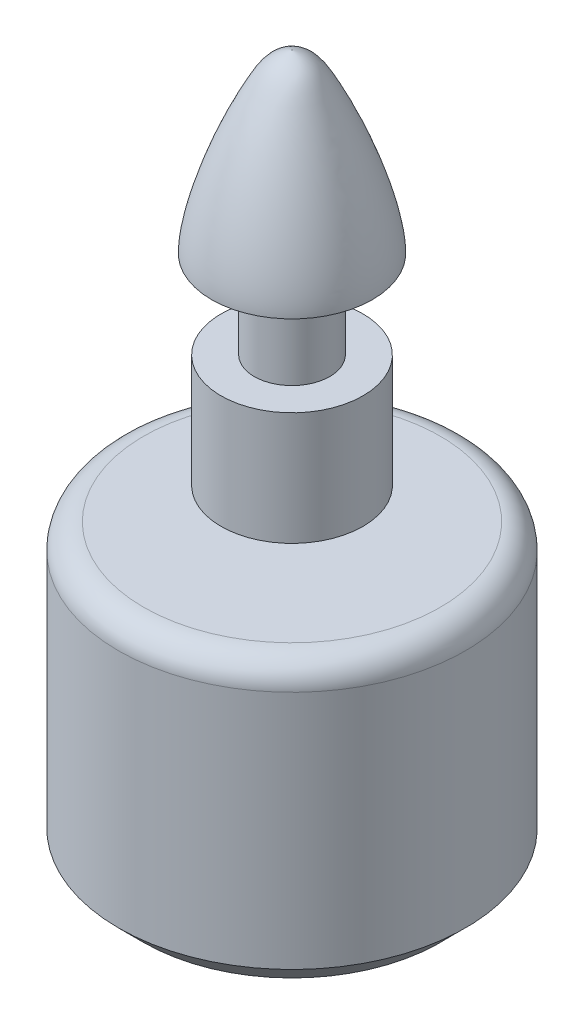
ISO-10303-21;
HEADER;
FILE_DESCRIPTION(('STEP AP214'),'2;1');
FILE_NAME('part.step','',(''),(''),'','','');
FILE_SCHEMA(('AUTOMOTIVE_DESIGN { 1 0 10303 214 1 1 1 1 }'));
ENDSEC;
DATA;
#1=APPLICATION_CONTEXT('core data for automotive mechanical design processes');
#2=APPLICATION_PROTOCOL_DEFINITION('international standard','automotive_design',2000,#1);
#3=PRODUCT_CONTEXT('',#1,'mechanical');
#4=PRODUCT('Part','Part','',(#3));
#5=PRODUCT_RELATED_PRODUCT_CATEGORY('part','',(#4));
#6=PRODUCT_DEFINITION_FORMATION('','',#4);
#7=PRODUCT_DEFINITION_CONTEXT('part definition',#1,'design');
#8=PRODUCT_DEFINITION('design','',#6,#7);
#9=PRODUCT_DEFINITION_SHAPE('','',#8);
#10=(LENGTH_UNIT() NAMED_UNIT(*) SI_UNIT(.MILLI.,.METRE.));
#11=(NAMED_UNIT(*) PLANE_ANGLE_UNIT() SI_UNIT($,.RADIAN.));
#12=(NAMED_UNIT(*) SI_UNIT($,.STERADIAN.) SOLID_ANGLE_UNIT());
#13=UNCERTAINTY_MEASURE_WITH_UNIT(LENGTH_MEASURE(1.E-05),#10,'distance_accuracy_value','');
#14=(GEOMETRIC_REPRESENTATION_CONTEXT(3) GLOBAL_UNCERTAINTY_ASSIGNED_CONTEXT((#13)) GLOBAL_UNIT_ASSIGNED_CONTEXT((#10,
#11,#12)) REPRESENTATION_CONTEXT('',''));
#15=CARTESIAN_POINT('',(0.,0.,0.));
#16=DIRECTION('',(0.,0.,1.));
#17=DIRECTION('',(1.,0.,0.));
#18=AXIS2_PLACEMENT_3D('',#15,#16,#17);
#19=CARTESIAN_POINT('',(0.,0.,0.));
#20=DIRECTION('',(0.,1.,0.));
#21=DIRECTION('',(0.,0.,1.));
#22=AXIS2_PLACEMENT_3D('',#19,#20,#21);
#23=PLANE('',#22);
#24=CARTESIAN_POINT('',(0.,0.,0.));
#25=DIRECTION('',(0.,1.,0.));
#26=DIRECTION('',(0.,0.,1.));
#27=AXIS2_PLACEMENT_3D('',#24,#25,#26);
#28=CIRCLE('',#27,11.8);
#29=CARTESIAN_POINT('',(0.,0.,11.8));
#30=VERTEX_POINT('',#29);
#31=EDGE_CURVE('E11',#30,#30,#28,.F.);
#32=ORIENTED_EDGE('',*,*,#31,.T.);
#33=EDGE_LOOP('',(#32));
#34=FACE_BOUND('',#33,.T.);
#35=CARTESIAN_POINT('',(0.,0.,-9.5));
#36=DIRECTION('',(0.,1.,0.));
#37=DIRECTION('',(0.,0.,1.));
#38=AXIS2_PLACEMENT_3D('',#35,#36,#37);
#39=CIRCLE('',#38,1.25);
#40=CARTESIAN_POINT('',(0.,0.,-8.25));
#41=VERTEX_POINT('',#40);
#42=EDGE_CURVE('E99',#41,#41,#39,.T.);
#43=ORIENTED_EDGE('',*,*,#42,.T.);
#44=EDGE_LOOP('',(#43));
#45=FACE_BOUND('',#44,.T.);
#46=CARTESIAN_POINT('',(0.,0.,9.5));
#47=DIRECTION('',(0.,1.,0.));
#48=DIRECTION('',(0.,0.,1.));
#49=AXIS2_PLACEMENT_3D('',#46,#47,#48);
#50=CIRCLE('',#49,1.25);
#51=CARTESIAN_POINT('',(0.,0.,10.75));
#52=VERTEX_POINT('',#51);
#53=EDGE_CURVE('E103',#52,#52,#50,.T.);
#54=ORIENTED_EDGE('',*,*,#53,.T.);
#55=EDGE_LOOP('',(#54));
#56=FACE_BOUND('',#55,.T.);
#57=CARTESIAN_POINT('',(8.,0.,0.));
#58=DIRECTION('',(0.,1.,0.));
#59=DIRECTION('',(0.,0.,1.));
#60=AXIS2_PLACEMENT_3D('',#57,#58,#59);
#61=CIRCLE('',#60,1.25);
#62=CARTESIAN_POINT('',(8.,0.,1.25));
#63=VERTEX_POINT('',#62);
#64=EDGE_CURVE('E117',#63,#63,#61,.T.);
#65=ORIENTED_EDGE('',*,*,#64,.T.);
#66=EDGE_LOOP('',(#65));
#67=FACE_BOUND('',#66,.T.);
#68=CARTESIAN_POINT('',(-8.,0.,0.));
#69=DIRECTION('',(0.,1.,0.));
#70=DIRECTION('',(0.,0.,1.));
#71=AXIS2_PLACEMENT_3D('',#68,#69,#70);
#72=CIRCLE('',#71,1.25);
#73=CARTESIAN_POINT('',(-8.,0.,1.25));
#74=VERTEX_POINT('',#73);
#75=EDGE_CURVE('E123',#74,#74,#72,.T.);
#76=ORIENTED_EDGE('',*,*,#75,.T.);
#77=EDGE_LOOP('',(#76));
#78=FACE_BOUND('',#77,.T.);
#79=ADVANCED_FACE('F38',(#34,#45,#56,#67,#78),#23,.F.);
#80=CARTESIAN_POINT('',(0.,4.6,0.));
#81=DIRECTION('',(0.,-1.,0.));
#82=DIRECTION('',(0.,0.,-1.));
#83=AXIS2_PLACEMENT_3D('',#80,#81,#82);
#84=CYLINDRICAL_SURFACE('',#83,13.8);
#85=CARTESIAN_POINT('',(0.,2.,0.));
#86=DIRECTION('',(0.,1.,0.));
#87=DIRECTION('',(0.,0.,1.));
#88=AXIS2_PLACEMENT_3D('',#85,#86,#87);
#89=CIRCLE('',#88,13.8);
#90=CARTESIAN_POINT('',(0.,2.,13.8));
#91=VERTEX_POINT('',#90);
#92=EDGE_CURVE('E45',#91,#91,#89,.T.);
#93=ORIENTED_EDGE('',*,*,#92,.T.);
#94=EDGE_LOOP('',(#93));
#95=FACE_BOUND('',#94,.T.);
#96=CARTESIAN_POINT('',(0.,21.1,0.));
#97=DIRECTION('',(0.,1.,0.));
#98=DIRECTION('',(0.,0.,1.));
#99=AXIS2_PLACEMENT_3D('',#96,#97,#98);
#100=CIRCLE('',#99,13.8);
#101=CARTESIAN_POINT('',(0.,21.1,13.8));
#102=VERTEX_POINT('',#101);
#103=EDGE_CURVE('E94',#102,#102,#100,.F.);
#104=ORIENTED_EDGE('',*,*,#103,.T.);
#105=EDGE_LOOP('',(#104));
#106=FACE_BOUND('',#105,.T.);
#107=ADVANCED_FACE('F64',(#95,#106),#84,.T.);
#108=CARTESIAN_POINT('',(0.,4.6,-9.5));
#109=DIRECTION('',(0.,-1.,0.));
#110=DIRECTION('',(0.,0.,-1.));
#111=AXIS2_PLACEMENT_3D('',#108,#109,#110);
#112=CYLINDRICAL_SURFACE('',#111,1.25);
#113=CARTESIAN_POINT('',(0.,4.6,-9.5));
#114=DIRECTION('',(0.,1.,0.));
#115=DIRECTION('',(0.,0.,1.));
#116=AXIS2_PLACEMENT_3D('',#113,#114,#115);
#117=CIRCLE('',#116,1.25);
#118=CARTESIAN_POINT('',(0.,4.6,-8.25));
#119=VERTEX_POINT('',#118);
#120=EDGE_CURVE('E110',#119,#119,#117,.T.);
#121=ORIENTED_EDGE('',*,*,#120,.T.);
#122=EDGE_LOOP('',(#121));
#123=FACE_BOUND('',#122,.T.);
#124=ORIENTED_EDGE('',*,*,#42,.F.);
#125=EDGE_LOOP('',(#124));
#126=FACE_BOUND('',#125,.T.);
#127=ADVANCED_FACE('F70',(#123,#126),#112,.F.);
#128=CARTESIAN_POINT('',(0.,4.6,9.5));
#129=DIRECTION('',(0.,-1.,0.));
#130=DIRECTION('',(0.,0.,-1.));
#131=AXIS2_PLACEMENT_3D('',#128,#129,#130);
#132=CYLINDRICAL_SURFACE('',#131,1.25);
#133=CARTESIAN_POINT('',(0.,4.6,9.5));
#134=DIRECTION('',(0.,1.,0.));
#135=DIRECTION('',(0.,0.,1.));
#136=AXIS2_PLACEMENT_3D('',#133,#134,#135);
#137=CIRCLE('',#136,1.25);
#138=CARTESIAN_POINT('',(0.,4.6,10.75));
#139=VERTEX_POINT('',#138);
#140=EDGE_CURVE('E114',#139,#139,#137,.T.);
#141=ORIENTED_EDGE('',*,*,#140,.T.);
#142=EDGE_LOOP('',(#141));
#143=FACE_BOUND('',#142,.T.);
#144=ORIENTED_EDGE('',*,*,#53,.F.);
#145=EDGE_LOOP('',(#144));
#146=FACE_BOUND('',#145,.T.);
#147=ADVANCED_FACE('F188',(#143,#146),#132,.F.);
#148=CARTESIAN_POINT('',(8.,4.6,0.));
#149=DIRECTION('',(0.,-1.,0.));
#150=DIRECTION('',(0.,0.,-1.));
#151=AXIS2_PLACEMENT_3D('',#148,#149,#150);
#152=CYLINDRICAL_SURFACE('',#151,1.25);
#153=CARTESIAN_POINT('',(8.,4.6,0.));
#154=DIRECTION('',(0.,1.,0.));
#155=DIRECTION('',(0.,0.,1.));
#156=AXIS2_PLACEMENT_3D('',#153,#154,#155);
#157=CIRCLE('',#156,1.25);
#158=CARTESIAN_POINT('',(8.,4.6,1.25));
#159=VERTEX_POINT('',#158);
#160=EDGE_CURVE('E113',#159,#159,#157,.T.);
#161=ORIENTED_EDGE('',*,*,#160,.T.);
#162=EDGE_LOOP('',(#161));
#163=FACE_BOUND('',#162,.T.);
#164=ORIENTED_EDGE('',*,*,#64,.F.);
#165=EDGE_LOOP('',(#164));
#166=FACE_BOUND('',#165,.T.);
#167=ADVANCED_FACE('F185',(#163,#166),#152,.F.);
#168=CARTESIAN_POINT('',(-8.,4.6,0.));
#169=DIRECTION('',(0.,-1.,0.));
#170=DIRECTION('',(0.,0.,-1.));
#171=AXIS2_PLACEMENT_3D('',#168,#169,#170);
#172=CYLINDRICAL_SURFACE('',#171,1.25);
#173=CARTESIAN_POINT('',(-8.,4.6,0.));
#174=DIRECTION('',(0.,1.,0.));
#175=DIRECTION('',(0.,0.,1.));
#176=AXIS2_PLACEMENT_3D('',#173,#174,#175);
#177=CIRCLE('',#176,1.25);
#178=CARTESIAN_POINT('',(-8.,4.6,1.25));
#179=VERTEX_POINT('',#178);
#180=EDGE_CURVE('E120',#179,#179,#177,.T.);
#181=ORIENTED_EDGE('',*,*,#180,.T.);
#182=EDGE_LOOP('',(#181));
#183=FACE_BOUND('',#182,.T.);
#184=ORIENTED_EDGE('',*,*,#75,.F.);
#185=EDGE_LOOP('',(#184));
#186=FACE_BOUND('',#185,.T.);
#187=ADVANCED_FACE('F182',(#183,#186),#172,.F.);
#188=CARTESIAN_POINT('',(0.,4.6,0.));
#189=DIRECTION('',(0.,1.,0.));
#190=DIRECTION('',(0.,0.,1.));
#191=AXIS2_PLACEMENT_3D('',#188,#189,#190);
#192=PLANE('',#191);
#193=ORIENTED_EDGE('',*,*,#180,.F.);
#194=EDGE_LOOP('',(#193));
#195=FACE_BOUND('',#194,.T.);
#196=ADVANCED_FACE('F181',(#195),#192,.F.);
#197=ORIENTED_EDGE('',*,*,#140,.F.);
#198=EDGE_LOOP('',(#197));
#199=FACE_BOUND('',#198,.T.);
#200=ADVANCED_FACE('F207',(#199),#192,.F.);
#201=ORIENTED_EDGE('',*,*,#120,.F.);
#202=EDGE_LOOP('',(#201));
#203=FACE_BOUND('',#202,.T.);
#204=ADVANCED_FACE('F179',(#203),#192,.F.);
#205=ORIENTED_EDGE('',*,*,#160,.F.);
#206=EDGE_LOOP('',(#205));
#207=FACE_BOUND('',#206,.T.);
#208=ADVANCED_FACE('F88',(#207),#192,.F.);
#209=CARTESIAN_POINT('',(0.,23.1,0.));
#210=DIRECTION('',(0.,1.,0.));
#211=DIRECTION('',(0.,0.,1.));
#212=AXIS2_PLACEMENT_3D('',#209,#210,#211);
#213=PLANE('',#212);
#214=CARTESIAN_POINT('',(0.,23.1,0.));
#215=DIRECTION('',(0.,-1.,0.));
#216=DIRECTION('',(1.,0.,0.));
#217=AXIS2_PLACEMENT_3D('',#214,#215,#216);
#218=CIRCLE('',#217,1.5);
#219=CARTESIAN_POINT('',(1.5,23.1,0.));
#220=VERTEX_POINT('',#219);
#221=EDGE_CURVE('E130',#220,#220,#218,.T.);
#222=ORIENTED_EDGE('',*,*,#221,.T.);
#223=EDGE_LOOP('',(#222));
#224=FACE_BOUND('',#223,.T.);
#225=CARTESIAN_POINT('',(0.,23.1,0.));
#226=DIRECTION('',(0.,1.,0.));
#227=DIRECTION('',(0.,0.,1.));
#228=AXIS2_PLACEMENT_3D('',#225,#226,#227);
#229=CIRCLE('',#228,11.8);
#230=CARTESIAN_POINT('',(0.,23.1,11.8));
#231=VERTEX_POINT('',#230);
#232=EDGE_CURVE('E97',#231,#231,#229,.T.);
#233=ORIENTED_EDGE('',*,*,#232,.T.);
#234=EDGE_LOOP('',(#233));
#235=FACE_BOUND('',#234,.T.);
#236=ADVANCED_FACE('F79',(#224,#235),#213,.T.);
#237=CARTESIAN_POINT('',(0.,21.1,0.));
#238=DIRECTION('',(0.,1.,0.));
#239=DIRECTION('',(0.,0.,1.));
#240=AXIS2_PLACEMENT_3D('',#237,#238,#239);
#241=TOROIDAL_SURFACE('',#240,11.8,2.);
#242=ORIENTED_EDGE('',*,*,#103,.F.);
#243=EDGE_LOOP('',(#242));
#244=FACE_BOUND('',#243,.T.);
#245=ORIENTED_EDGE('',*,*,#232,.F.);
#246=EDGE_LOOP('',(#245));
#247=FACE_BOUND('',#246,.T.);
#248=ADVANCED_FACE('F76',(#244,#247),#241,.T.);
#249=CARTESIAN_POINT('',(0.,23.1,0.));
#250=DIRECTION('',(0.,-1.,0.));
#251=DIRECTION('',(1.,0.,0.));
#252=AXIS2_PLACEMENT_3D('',#249,#250,#251);
#253=CYLINDRICAL_SURFACE('',#252,1.5);
#254=ORIENTED_EDGE('',*,*,#221,.F.);
#255=EDGE_LOOP('',(#254));
#256=FACE_BOUND('',#255,.T.);
#257=CARTESIAN_POINT('',(0.,25.6,0.));
#258=DIRECTION('',(0.,-1.,0.));
#259=DIRECTION('',(1.,0.,0.));
#260=AXIS2_PLACEMENT_3D('',#257,#258,#259);
#261=CIRCLE('',#260,1.5);
#262=CARTESIAN_POINT('',(1.5,25.6,0.));
#263=VERTEX_POINT('',#262);
#264=EDGE_CURVE('E133',#263,#263,#261,.T.);
#265=ORIENTED_EDGE('',*,*,#264,.T.);
#266=EDGE_LOOP('',(#265));
#267=FACE_BOUND('',#266,.T.);
#268=ADVANCED_FACE('F78',(#256,#267),#253,.T.);
#269=CARTESIAN_POINT('',(-5.65,25.6,0.));
#270=DIRECTION('',(0.,1.,0.));
#271=DIRECTION('',(-1.,0.,0.));
#272=AXIS2_PLACEMENT_3D('',#269,#270,#271);
#273=PLANE('',#272);
#274=ORIENTED_EDGE('',*,*,#264,.F.);
#275=EDGE_LOOP('',(#274));
#276=FACE_BOUND('',#275,.T.);
#277=CARTESIAN_POINT('',(0.,25.6,0.));
#278=DIRECTION('',(0.,-1.,0.));
#279=DIRECTION('',(1.,0.,0.));
#280=AXIS2_PLACEMENT_3D('',#277,#278,#279);
#281=CIRCLE('',#280,5.65);
#282=CARTESIAN_POINT('',(5.65,25.6,0.));
#283=VERTEX_POINT('',#282);
#284=EDGE_CURVE('E136',#283,#283,#281,.T.);
#285=ORIENTED_EDGE('',*,*,#284,.T.);
#286=EDGE_LOOP('',(#285));
#287=FACE_BOUND('',#286,.T.);
#288=ADVANCED_FACE('F85',(#276,#287),#273,.F.);
#289=CARTESIAN_POINT('',(0.,23.1,0.));
#290=DIRECTION('',(0.,-1.,0.));
#291=DIRECTION('',(1.,0.,0.));
#292=AXIS2_PLACEMENT_3D('',#289,#290,#291);
#293=CYLINDRICAL_SURFACE('',#292,5.65);
#294=ORIENTED_EDGE('',*,*,#284,.F.);
#295=EDGE_LOOP('',(#294));
#296=FACE_BOUND('',#295,.T.);
#297=CARTESIAN_POINT('',(0.,34.6,0.));
#298=DIRECTION('',(0.,-1.,0.));
#299=DIRECTION('',(1.,0.,0.));
#300=AXIS2_PLACEMENT_3D('',#297,#298,#299);
#301=CIRCLE('',#300,5.65);
#302=CARTESIAN_POINT('',(5.65,34.6,0.));
#303=VERTEX_POINT('',#302);
#304=EDGE_CURVE('E139',#303,#303,#301,.T.);
#305=ORIENTED_EDGE('',*,*,#304,.T.);
#306=EDGE_LOOP('',(#305));
#307=FACE_BOUND('',#306,.T.);
#308=ADVANCED_FACE('F166',(#296,#307),#293,.T.);
#309=CARTESIAN_POINT('',(-5.65,34.6,0.));
#310=DIRECTION('',(0.,-1.,0.));
#311=DIRECTION('',(1.,0.,0.));
#312=AXIS2_PLACEMENT_3D('',#309,#310,#311);
#313=PLANE('',#312);
#314=ORIENTED_EDGE('',*,*,#304,.F.);
#315=EDGE_LOOP('',(#314));
#316=FACE_BOUND('',#315,.T.);
#317=CARTESIAN_POINT('',(0.,34.6,0.));
#318=DIRECTION('',(0.,-1.,0.));
#319=DIRECTION('',(1.,0.,0.));
#320=AXIS2_PLACEMENT_3D('',#317,#318,#319);
#321=CIRCLE('',#320,3.);
#322=CARTESIAN_POINT('',(3.,34.6,0.));
#323=VERTEX_POINT('',#322);
#324=EDGE_CURVE('E142',#323,#323,#321,.T.);
#325=ORIENTED_EDGE('',*,*,#324,.T.);
#326=EDGE_LOOP('',(#325));
#327=FACE_BOUND('',#326,.T.);
#328=ADVANCED_FACE('F160',(#316,#327),#313,.F.);
#329=CARTESIAN_POINT('',(0.,23.1,0.));
#330=DIRECTION('',(0.,-1.,0.));
#331=DIRECTION('',(1.,0.,0.));
#332=AXIS2_PLACEMENT_3D('',#329,#330,#331);
#333=CYLINDRICAL_SURFACE('',#332,3.);
#334=ORIENTED_EDGE('',*,*,#324,.F.);
#335=EDGE_LOOP('',(#334));
#336=FACE_BOUND('',#335,.T.);
#337=CARTESIAN_POINT('',(0.,41.6,0.));
#338=DIRECTION('',(0.,-1.,0.));
#339=DIRECTION('',(1.,0.,0.));
#340=AXIS2_PLACEMENT_3D('',#337,#338,#339);
#341=CIRCLE('',#340,3.);
#342=CARTESIAN_POINT('',(3.,41.6,0.));
#343=VERTEX_POINT('',#342);
#344=EDGE_CURVE('E145',#343,#343,#341,.T.);
#345=ORIENTED_EDGE('',*,*,#344,.T.);
#346=EDGE_LOOP('',(#345));
#347=FACE_BOUND('',#346,.T.);
#348=ADVANCED_FACE('F58',(#336,#347),#333,.T.);
#349=CARTESIAN_POINT('',(-3.,41.6,0.));
#350=DIRECTION('',(0.,1.,0.));
#351=DIRECTION('',(-1.,0.,0.));
#352=AXIS2_PLACEMENT_3D('',#349,#350,#351);
#353=PLANE('',#352);
#354=ORIENTED_EDGE('',*,*,#344,.F.);
#355=EDGE_LOOP('',(#354));
#356=FACE_BOUND('',#355,.T.);
#357=CARTESIAN_POINT('',(0.,41.6,0.));
#358=DIRECTION('',(0.,-1.,0.));
#359=DIRECTION('',(1.,0.,0.));
#360=AXIS2_PLACEMENT_3D('',#357,#358,#359);
#361=CIRCLE('',#360,6.4);
#362=CARTESIAN_POINT('',(6.4,41.6,0.));
#363=VERTEX_POINT('',#362);
#364=EDGE_CURVE('E148',#363,#363,#361,.T.);
#365=ORIENTED_EDGE('',*,*,#364,.T.);
#366=EDGE_LOOP('',(#365));
#367=FACE_BOUND('',#366,.T.);
#368=ADVANCED_FACE('F50',(#356,#367),#353,.F.);
#369=CARTESIAN_POINT('',(0.,55.6,0.));
#370=CARTESIAN_POINT('',(-0.448143346631708,55.484061034839,0.));
#371=CARTESIAN_POINT('',(-1.52331682836557,55.0798784491294,0.));
#372=CARTESIAN_POINT('',(-4.65230624773557,49.5712874704268,0.));
#373=CARTESIAN_POINT('',(-6.4,43.7971950658367,0.));
#374=CARTESIAN_POINT('',(-6.4,41.6,0.));
#375=B_SPLINE_CURVE_WITH_KNOTS('',3,(#369,#370,#371,#372,#373,#374),.UNSPECIFIED.,.F.,.F.,(4,1,
1,4),(0.,0.157070913801252,0.257070913801252,1.),.UNSPECIFIED.);
#376=CARTESIAN_POINT('',(0.,23.1,0.));
#377=DIRECTION('',(0.,-1.,0.));
#378=AXIS1_PLACEMENT('',#376,#377);
#379=SURFACE_OF_REVOLUTION('',#375,#378);
#380=ORIENTED_EDGE('',*,*,#364,.F.);
#381=EDGE_LOOP('',(#380));
#382=FACE_BOUND('',#381,.T.);
#383=CARTESIAN_POINT('',(0.,55.6,0.));
#384=VERTEX_POINT('',#383);
#385=VERTEX_LOOP('',#384);
#386=FACE_BOUND('',#385,.T.);
#387=ADVANCED_FACE('F48',(#382,#386),#379,.T.);
#388=CARTESIAN_POINT('',(0.,2.,0.));
#389=DIRECTION('',(0.,1.,0.));
#390=DIRECTION('',(0.,0.,1.));
#391=AXIS2_PLACEMENT_3D('',#388,#389,#390);
#392=CONICAL_SURFACE('',#391,13.8,0.78539816339745);
#393=ORIENTED_EDGE('',*,*,#31,.F.);
#394=EDGE_LOOP('',(#393));
#395=FACE_BOUND('',#394,.T.);
#396=ORIENTED_EDGE('',*,*,#92,.F.);
#397=EDGE_LOOP('',(#396));
#398=FACE_BOUND('',#397,.T.);
#399=ADVANCED_FACE('F40',(#395,#398),#392,.T.);
#400=CLOSED_SHELL('',(#79,#107,#127,#147,#167,#187,#196,#200,#204,#208,#236,#248,#268,#288,#308,
#328,#348,#368,#387,#399));
#401=MANIFOLD_SOLID_BREP('B2',#400);
#402=ADVANCED_BREP_SHAPE_REPRESENTATION('',(#18,#401),#14);
#403=SHAPE_DEFINITION_REPRESENTATION(#9,#402);
ENDSEC;
END-ISO-10303-21;
